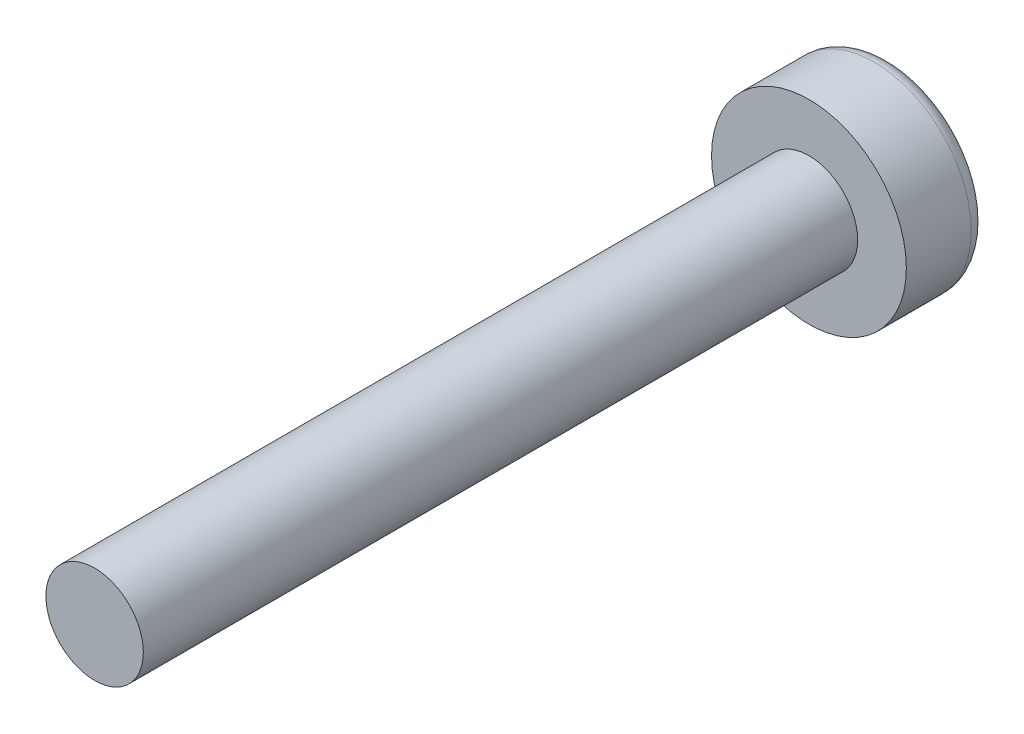
ISO-10303-21;
HEADER;
FILE_DESCRIPTION(('STEP AP214'),'2;1');
FILE_NAME('part.step','',(''),(''),'','','');
FILE_SCHEMA(('AUTOMOTIVE_DESIGN { 1 0 10303 214 1 1 1 1 }'));
ENDSEC;
DATA;
#1=APPLICATION_CONTEXT('core data for automotive mechanical design processes');
#2=APPLICATION_PROTOCOL_DEFINITION('international standard','automotive_design',2000,#1);
#3=PRODUCT_CONTEXT('',#1,'mechanical');
#4=PRODUCT('Part','Part','',(#3));
#5=PRODUCT_RELATED_PRODUCT_CATEGORY('part','',(#4));
#6=PRODUCT_DEFINITION_FORMATION('','',#4);
#7=PRODUCT_DEFINITION_CONTEXT('part definition',#1,'design');
#8=PRODUCT_DEFINITION('design','',#6,#7);
#9=PRODUCT_DEFINITION_SHAPE('','',#8);
#10=(LENGTH_UNIT() NAMED_UNIT(*) SI_UNIT(.MILLI.,.METRE.));
#11=(NAMED_UNIT(*) PLANE_ANGLE_UNIT() SI_UNIT($,.RADIAN.));
#12=(NAMED_UNIT(*) SI_UNIT($,.STERADIAN.) SOLID_ANGLE_UNIT());
#13=UNCERTAINTY_MEASURE_WITH_UNIT(LENGTH_MEASURE(1.E-05),#10,'distance_accuracy_value','');
#14=(GEOMETRIC_REPRESENTATION_CONTEXT(3) GLOBAL_UNCERTAINTY_ASSIGNED_CONTEXT((#13)) GLOBAL_UNIT_ASSIGNED_CONTEXT((#10,
#11,#12)) REPRESENTATION_CONTEXT('',''));
#15=CARTESIAN_POINT('',(0.,0.,0.));
#16=DIRECTION('',(0.,0.,1.));
#17=DIRECTION('',(1.,0.,0.));
#18=AXIS2_PLACEMENT_3D('',#15,#16,#17);
#19=CARTESIAN_POINT('',(0.,0.,2.5));
#20=DIRECTION('',(0.,0.,1.));
#21=DIRECTION('',(1.,0.,0.));
#22=AXIS2_PLACEMENT_3D('',#19,#20,#21);
#23=PLANE('',#22);
#24=CARTESIAN_POINT('',(0.,0.,2.5));
#25=DIRECTION('',(0.,0.,1.));
#26=DIRECTION('',(1.,0.,0.));
#27=AXIS2_PLACEMENT_3D('',#24,#25,#26);
#28=CIRCLE('',#27,3.);
#29=CARTESIAN_POINT('',(3.,0.,2.5));
#30=VERTEX_POINT('',#29);
#31=EDGE_CURVE('E148',#30,#30,#28,.T.);
#32=ORIENTED_EDGE('',*,*,#31,.T.);
#33=EDGE_LOOP('',(#32));
#34=FACE_BOUND('',#33,.T.);
#35=CARTESIAN_POINT('',(0.,0.,2.5));
#36=DIRECTION('',(0.,0.,1.));
#37=DIRECTION('',(1.,0.,0.));
#38=AXIS2_PLACEMENT_3D('',#35,#36,#37);
#39=CIRCLE('',#38,1.5);
#40=CARTESIAN_POINT('',(1.5,0.,2.5));
#41=VERTEX_POINT('',#40);
#42=EDGE_CURVE('E136',#41,#41,#39,.T.);
#43=ORIENTED_EDGE('',*,*,#42,.F.);
#44=EDGE_LOOP('',(#43));
#45=FACE_BOUND('',#44,.T.);
#46=ADVANCED_FACE('F33',(#34,#45),#23,.T.);
#47=CARTESIAN_POINT('',(0.,0.,2.5));
#48=DIRECTION('',(0.,0.,-1.));
#49=DIRECTION('',(-1.,0.,0.));
#50=AXIS2_PLACEMENT_3D('',#47,#48,#49);
#51=CYLINDRICAL_SURFACE('',#50,3.);
#52=CARTESIAN_POINT('',(0.,0.,0.5));
#53=DIRECTION('',(0.,0.,1.));
#54=DIRECTION('',(1.,0.,0.));
#55=AXIS2_PLACEMENT_3D('',#52,#53,#54);
#56=CIRCLE('',#55,3.);
#57=CARTESIAN_POINT('',(3.,0.,0.5));
#58=VERTEX_POINT('',#57);
#59=EDGE_CURVE('E41',#58,#58,#56,.T.);
#60=ORIENTED_EDGE('',*,*,#59,.T.);
#61=EDGE_LOOP('',(#60));
#62=FACE_BOUND('',#61,.T.);
#63=ORIENTED_EDGE('',*,*,#31,.F.);
#64=EDGE_LOOP('',(#63));
#65=FACE_BOUND('',#64,.T.);
#66=ADVANCED_FACE('F35',(#62,#65),#51,.T.);
#67=CARTESIAN_POINT('',(0.,0.,0.));
#68=DIRECTION('',(0.,0.,1.));
#69=DIRECTION('',(1.,0.,0.));
#70=AXIS2_PLACEMENT_3D('',#67,#68,#69);
#71=PLANE('',#70);
#72=DIRECTION('',(0.5,0.866025403784439,0.));
#73=VECTOR('',#72,1.);
#74=CARTESIAN_POINT('',(-1.73205080756888,0.,0.));
#75=LINE('',#74,#73);
#76=CARTESIAN_POINT('',(-1.73205080756888,0.,0.));
#77=VERTEX_POINT('',#76);
#78=CARTESIAN_POINT('',(-0.866025403784438,1.5,0.));
#79=VERTEX_POINT('',#78);
#80=EDGE_CURVE('E102',#77,#79,#75,.T.);
#81=ORIENTED_EDGE('',*,*,#80,.F.);
#82=DIRECTION('',(-0.5,0.866025403784439,0.));
#83=VECTOR('',#82,1.);
#84=CARTESIAN_POINT('',(-0.866025403784439,-1.5,0.));
#85=LINE('',#84,#83);
#86=CARTESIAN_POINT('',(-0.866025403784439,-1.5,0.));
#87=VERTEX_POINT('',#86);
#88=EDGE_CURVE('E48',#87,#77,#85,.T.);
#89=ORIENTED_EDGE('',*,*,#88,.F.);
#90=DIRECTION('',(-1.,0.,0.));
#91=VECTOR('',#90,1.);
#92=CARTESIAN_POINT('',(0.866025403784438,-1.5,0.));
#93=LINE('',#92,#91);
#94=CARTESIAN_POINT('',(0.866025403784438,-1.5,0.));
#95=VERTEX_POINT('',#94);
#96=EDGE_CURVE('E118',#95,#87,#93,.T.);
#97=ORIENTED_EDGE('',*,*,#96,.F.);
#98=DIRECTION('',(-0.5,-0.866025403784438,0.));
#99=VECTOR('',#98,1.);
#100=CARTESIAN_POINT('',(1.73205080756888,0.,0.));
#101=LINE('',#100,#99);
#102=CARTESIAN_POINT('',(1.73205080756888,0.,0.));
#103=VERTEX_POINT('',#102);
#104=EDGE_CURVE('E112',#103,#95,#101,.T.);
#105=ORIENTED_EDGE('',*,*,#104,.F.);
#106=DIRECTION('',(0.5,-0.866025403784439,0.));
#107=VECTOR('',#106,1.);
#108=CARTESIAN_POINT('',(0.866025403784438,1.5,0.));
#109=LINE('',#108,#107);
#110=CARTESIAN_POINT('',(0.866025403784438,1.5,0.));
#111=VERTEX_POINT('',#110);
#112=EDGE_CURVE('E110',#111,#103,#109,.T.);
#113=ORIENTED_EDGE('',*,*,#112,.F.);
#114=DIRECTION('',(1.,0.,0.));
#115=VECTOR('',#114,1.);
#116=CARTESIAN_POINT('',(-0.866025403784438,1.5,0.));
#117=LINE('',#116,#115);
#118=EDGE_CURVE('E91',#79,#111,#117,.T.);
#119=ORIENTED_EDGE('',*,*,#118,.F.);
#120=EDGE_LOOP('',(#81,#89,#97,#105,#113,#119));
#121=FACE_BOUND('',#120,.T.);
#122=CARTESIAN_POINT('',(0.,0.,0.));
#123=DIRECTION('',(0.,0.,1.));
#124=DIRECTION('',(1.,0.,0.));
#125=AXIS2_PLACEMENT_3D('',#122,#123,#124);
#126=CIRCLE('',#125,2.5);
#127=CARTESIAN_POINT('',(2.5,0.,0.));
#128=VERTEX_POINT('',#127);
#129=EDGE_CURVE('E11',#128,#128,#126,.F.);
#130=ORIENTED_EDGE('',*,*,#129,.T.);
#131=EDGE_LOOP('',(#130));
#132=FACE_BOUND('',#131,.T.);
#133=ADVANCED_FACE('F106',(#121,#132),#71,.F.);
#134=CARTESIAN_POINT('',(0.,0.,24.5));
#135=DIRECTION('',(0.,0.,-1.));
#136=DIRECTION('',(-1.,0.,0.));
#137=AXIS2_PLACEMENT_3D('',#134,#135,#136);
#138=CYLINDRICAL_SURFACE('',#137,1.5);
#139=CARTESIAN_POINT('',(0.,0.,24.5));
#140=DIRECTION('',(0.,0.,1.));
#141=DIRECTION('',(1.,0.,0.));
#142=AXIS2_PLACEMENT_3D('',#139,#140,#141);
#143=CIRCLE('',#142,1.5);
#144=CARTESIAN_POINT('',(1.5,0.,24.5));
#145=VERTEX_POINT('',#144);
#146=EDGE_CURVE('E145',#145,#145,#143,.T.);
#147=ORIENTED_EDGE('',*,*,#146,.F.);
#148=EDGE_LOOP('',(#147));
#149=FACE_BOUND('',#148,.T.);
#150=ORIENTED_EDGE('',*,*,#42,.T.);
#151=EDGE_LOOP('',(#150));
#152=FACE_BOUND('',#151,.T.);
#153=ADVANCED_FACE('F167',(#149,#152),#138,.T.);
#154=CARTESIAN_POINT('',(0.,0.,24.5));
#155=DIRECTION('',(0.,0.,1.));
#156=DIRECTION('',(1.,0.,0.));
#157=AXIS2_PLACEMENT_3D('',#154,#155,#156);
#158=PLANE('',#157);
#159=ORIENTED_EDGE('',*,*,#146,.T.);
#160=EDGE_LOOP('',(#159));
#161=FACE_BOUND('',#160,.T.);
#162=ADVANCED_FACE('F158',(#161),#158,.T.);
#163=CARTESIAN_POINT('',(0.,0.,0.5));
#164=DIRECTION('',(0.,0.,1.));
#165=DIRECTION('',(1.,0.,0.));
#166=AXIS2_PLACEMENT_3D('',#163,#164,#165);
#167=TOROIDAL_SURFACE('',#166,2.5,0.5);
#168=ORIENTED_EDGE('',*,*,#129,.F.);
#169=EDGE_LOOP('',(#168));
#170=FACE_BOUND('',#169,.T.);
#171=ORIENTED_EDGE('',*,*,#59,.F.);
#172=EDGE_LOOP('',(#171));
#173=FACE_BOUND('',#172,.T.);
#174=ADVANCED_FACE('F155',(#170,#173),#167,.T.);
#175=CARTESIAN_POINT('',(-0.866025403784439,-1.5,2.));
#176=DIRECTION('',(-0.866025403784439,-0.5,0.));
#177=DIRECTION('',(0.5,-0.866025403784439,0.));
#178=AXIS2_PLACEMENT_3D('',#175,#176,#177);
#179=PLANE('',#178);
#180=ORIENTED_EDGE('',*,*,#88,.T.);
#181=DIRECTION('',(0.,0.,-1.));
#182=VECTOR('',#181,1.);
#183=CARTESIAN_POINT('',(-1.73205080756888,0.,2.));
#184=LINE('',#183,#182);
#185=CARTESIAN_POINT('',(-1.73205080756888,0.,2.));
#186=VERTEX_POINT('',#185);
#187=EDGE_CURVE('E99',#186,#77,#184,.T.);
#188=ORIENTED_EDGE('',*,*,#187,.F.);
#189=DIRECTION('',(-0.5,0.866025403784439,0.));
#190=VECTOR('',#189,1.);
#191=CARTESIAN_POINT('',(-0.866025403784439,-1.5,2.));
#192=LINE('',#191,#190);
#193=CARTESIAN_POINT('',(-0.866025403784439,-1.5,2.));
#194=VERTEX_POINT('',#193);
#195=EDGE_CURVE('E120',#194,#186,#192,.T.);
#196=ORIENTED_EDGE('',*,*,#195,.F.);
#197=DIRECTION('',(0.,0.,-1.));
#198=VECTOR('',#197,1.);
#199=CARTESIAN_POINT('',(-0.866025403784439,-1.5,2.));
#200=LINE('',#199,#198);
#201=EDGE_CURVE('E55',#194,#87,#200,.T.);
#202=ORIENTED_EDGE('',*,*,#201,.T.);
#203=EDGE_LOOP('',(#180,#188,#196,#202));
#204=FACE_BOUND('',#203,.T.);
#205=ADVANCED_FACE('F157',(#204),#179,.F.);
#206=CARTESIAN_POINT('',(0.866025403784438,-1.5,2.));
#207=DIRECTION('',(0.,-1.,0.));
#208=DIRECTION('',(1.,0.,0.));
#209=AXIS2_PLACEMENT_3D('',#206,#207,#208);
#210=PLANE('',#209);
#211=ORIENTED_EDGE('',*,*,#96,.T.);
#212=ORIENTED_EDGE('',*,*,#201,.F.);
#213=DIRECTION('',(-1.,0.,0.));
#214=VECTOR('',#213,1.);
#215=CARTESIAN_POINT('',(0.866025403784438,-1.5,2.));
#216=LINE('',#215,#214);
#217=CARTESIAN_POINT('',(0.866025403784438,-1.5,2.));
#218=VERTEX_POINT('',#217);
#219=EDGE_CURVE('E132',#218,#194,#216,.T.);
#220=ORIENTED_EDGE('',*,*,#219,.F.);
#221=DIRECTION('',(0.,0.,-1.));
#222=VECTOR('',#221,1.);
#223=CARTESIAN_POINT('',(0.866025403784438,-1.5,2.));
#224=LINE('',#223,#222);
#225=EDGE_CURVE('E137',#218,#95,#224,.T.);
#226=ORIENTED_EDGE('',*,*,#225,.T.);
#227=EDGE_LOOP('',(#211,#212,#220,#226));
#228=FACE_BOUND('',#227,.T.);
#229=ADVANCED_FACE('F165',(#228),#210,.F.);
#230=CARTESIAN_POINT('',(1.73205080756888,0.,2.));
#231=DIRECTION('',(0.866025403784438,-0.5,0.));
#232=DIRECTION('',(0.5,0.866025403784439,0.));
#233=AXIS2_PLACEMENT_3D('',#230,#231,#232);
#234=PLANE('',#233);
#235=ORIENTED_EDGE('',*,*,#104,.T.);
#236=ORIENTED_EDGE('',*,*,#225,.F.);
#237=DIRECTION('',(-0.5,-0.866025403784438,0.));
#238=VECTOR('',#237,1.);
#239=CARTESIAN_POINT('',(1.73205080756888,0.,2.));
#240=LINE('',#239,#238);
#241=CARTESIAN_POINT('',(1.73205080756888,0.,2.));
#242=VERTEX_POINT('',#241);
#243=EDGE_CURVE('E129',#242,#218,#240,.T.);
#244=ORIENTED_EDGE('',*,*,#243,.F.);
#245=DIRECTION('',(0.,0.,-1.));
#246=VECTOR('',#245,1.);
#247=CARTESIAN_POINT('',(1.73205080756888,0.,2.));
#248=LINE('',#247,#246);
#249=EDGE_CURVE('E139',#242,#103,#248,.T.);
#250=ORIENTED_EDGE('',*,*,#249,.T.);
#251=EDGE_LOOP('',(#235,#236,#244,#250));
#252=FACE_BOUND('',#251,.T.);
#253=ADVANCED_FACE('F212',(#252),#234,.F.);
#254=CARTESIAN_POINT('',(0.866025403784438,1.5,2.));
#255=DIRECTION('',(0.866025403784439,0.5,0.));
#256=DIRECTION('',(-0.5,0.866025403784439,0.));
#257=AXIS2_PLACEMENT_3D('',#254,#255,#256);
#258=PLANE('',#257);
#259=ORIENTED_EDGE('',*,*,#112,.T.);
#260=ORIENTED_EDGE('',*,*,#249,.F.);
#261=DIRECTION('',(0.5,-0.866025403784439,0.));
#262=VECTOR('',#261,1.);
#263=CARTESIAN_POINT('',(0.866025403784438,1.5,2.));
#264=LINE('',#263,#262);
#265=CARTESIAN_POINT('',(0.866025403784438,1.5,2.));
#266=VERTEX_POINT('',#265);
#267=EDGE_CURVE('E126',#266,#242,#264,.T.);
#268=ORIENTED_EDGE('',*,*,#267,.F.);
#269=DIRECTION('',(0.,0.,-1.));
#270=VECTOR('',#269,1.);
#271=CARTESIAN_POINT('',(0.866025403784438,1.5,2.));
#272=LINE('',#271,#270);
#273=EDGE_CURVE('E98',#266,#111,#272,.T.);
#274=ORIENTED_EDGE('',*,*,#273,.T.);
#275=EDGE_LOOP('',(#259,#260,#268,#274));
#276=FACE_BOUND('',#275,.T.);
#277=ADVANCED_FACE('F221',(#276),#258,.F.);
#278=CARTESIAN_POINT('',(-0.866025403784438,1.5,2.));
#279=DIRECTION('',(0.,1.,0.));
#280=DIRECTION('',(-1.,0.,0.));
#281=AXIS2_PLACEMENT_3D('',#278,#279,#280);
#282=PLANE('',#281);
#283=ORIENTED_EDGE('',*,*,#118,.T.);
#284=ORIENTED_EDGE('',*,*,#273,.F.);
#285=DIRECTION('',(1.,0.,0.));
#286=VECTOR('',#285,1.);
#287=CARTESIAN_POINT('',(-0.866025403784438,1.5,2.));
#288=LINE('',#287,#286);
#289=CARTESIAN_POINT('',(-0.866025403784438,1.5,2.));
#290=VERTEX_POINT('',#289);
#291=EDGE_CURVE('E94',#290,#266,#288,.T.);
#292=ORIENTED_EDGE('',*,*,#291,.F.);
#293=DIRECTION('',(0.,0.,-1.));
#294=VECTOR('',#293,1.);
#295=CARTESIAN_POINT('',(-0.866025403784438,1.5,2.));
#296=LINE('',#295,#294);
#297=EDGE_CURVE('E87',#290,#79,#296,.T.);
#298=ORIENTED_EDGE('',*,*,#297,.T.);
#299=EDGE_LOOP('',(#283,#284,#292,#298));
#300=FACE_BOUND('',#299,.T.);
#301=ADVANCED_FACE('F89',(#300),#282,.F.);
#302=CARTESIAN_POINT('',(-1.73205080756888,0.,2.));
#303=DIRECTION('',(-0.866025403784439,0.5,0.));
#304=DIRECTION('',(-0.5,-0.866025403784439,0.));
#305=AXIS2_PLACEMENT_3D('',#302,#303,#304);
#306=PLANE('',#305);
#307=ORIENTED_EDGE('',*,*,#80,.T.);
#308=ORIENTED_EDGE('',*,*,#297,.F.);
#309=DIRECTION('',(0.5,0.866025403784439,0.));
#310=VECTOR('',#309,1.);
#311=CARTESIAN_POINT('',(-1.73205080756888,0.,2.));
#312=LINE('',#311,#310);
#313=EDGE_CURVE('E123',#186,#290,#312,.T.);
#314=ORIENTED_EDGE('',*,*,#313,.F.);
#315=ORIENTED_EDGE('',*,*,#187,.T.);
#316=EDGE_LOOP('',(#307,#308,#314,#315));
#317=FACE_BOUND('',#316,.T.);
#318=ADVANCED_FACE('F103',(#317),#306,.F.);
#319=CARTESIAN_POINT('',(-2.59807621135331,1.5,2.));
#320=DIRECTION('',(0.,0.,-1.));
#321=DIRECTION('',(-1.,0.,0.));
#322=AXIS2_PLACEMENT_3D('',#319,#320,#321);
#323=PLANE('',#322);
#324=ORIENTED_EDGE('',*,*,#195,.T.);
#325=ORIENTED_EDGE('',*,*,#313,.T.);
#326=ORIENTED_EDGE('',*,*,#291,.T.);
#327=ORIENTED_EDGE('',*,*,#267,.T.);
#328=ORIENTED_EDGE('',*,*,#243,.T.);
#329=ORIENTED_EDGE('',*,*,#219,.T.);
#330=EDGE_LOOP('',(#324,#325,#326,#327,#328,#329));
#331=FACE_BOUND('',#330,.T.);
#332=ADVANCED_FACE('F248',(#331),#323,.T.);
#333=CLOSED_SHELL('',(#46,#66,#133,#153,#162,#174,#205,#229,#253,#277,#301,#318,#332));
#334=MANIFOLD_SOLID_BREP('B2',#333);
#335=ADVANCED_BREP_SHAPE_REPRESENTATION('',(#18,#334),#14);
#336=SHAPE_DEFINITION_REPRESENTATION(#9,#335);
ENDSEC;
END-ISO-10303-21;
